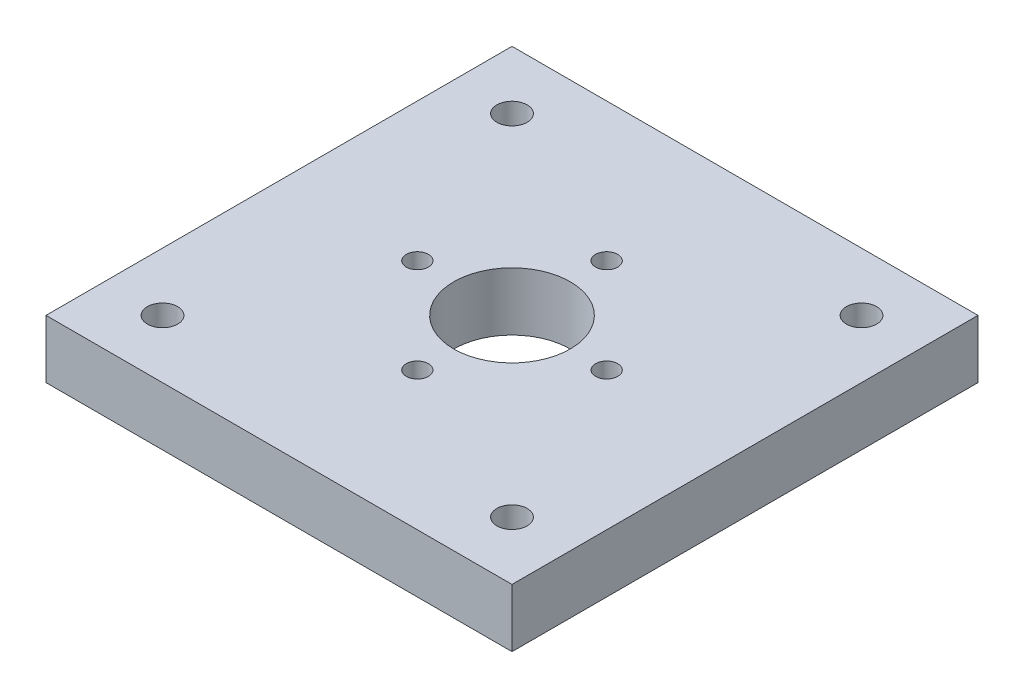
ISO-10303-21;
HEADER;
FILE_DESCRIPTION(('STEP AP214'),'2;1');
FILE_NAME('part.step','',(''),(''),'','','');
FILE_SCHEMA(('AUTOMOTIVE_DESIGN { 1 0 10303 214 1 1 1 1 }'));
ENDSEC;
DATA;
#1=APPLICATION_CONTEXT('core data for automotive mechanical design processes');
#2=APPLICATION_PROTOCOL_DEFINITION('international standard','automotive_design',2000,#1);
#3=PRODUCT_CONTEXT('',#1,'mechanical');
#4=PRODUCT('Part','Part','',(#3));
#5=PRODUCT_RELATED_PRODUCT_CATEGORY('part','',(#4));
#6=PRODUCT_DEFINITION_FORMATION('','',#4);
#7=PRODUCT_DEFINITION_CONTEXT('part definition',#1,'design');
#8=PRODUCT_DEFINITION('design','',#6,#7);
#9=PRODUCT_DEFINITION_SHAPE('','',#8);
#10=(LENGTH_UNIT() NAMED_UNIT(*) SI_UNIT(.MILLI.,.METRE.));
#11=(NAMED_UNIT(*) PLANE_ANGLE_UNIT() SI_UNIT($,.RADIAN.));
#12=(NAMED_UNIT(*) SI_UNIT($,.STERADIAN.) SOLID_ANGLE_UNIT());
#13=UNCERTAINTY_MEASURE_WITH_UNIT(LENGTH_MEASURE(1.E-05),#10,'distance_accuracy_value','');
#14=(GEOMETRIC_REPRESENTATION_CONTEXT(3) GLOBAL_UNCERTAINTY_ASSIGNED_CONTEXT((#13)) GLOBAL_UNIT_ASSIGNED_CONTEXT((#10,
#11,#12)) REPRESENTATION_CONTEXT('',''));
#15=CARTESIAN_POINT('',(0.,0.,0.));
#16=DIRECTION('',(0.,0.,1.));
#17=DIRECTION('',(1.,0.,0.));
#18=AXIS2_PLACEMENT_3D('',#15,#16,#17);
#19=CARTESIAN_POINT('',(0.,0.5,0.));
#20=DIRECTION('',(0.,1.,0.));
#21=DIRECTION('',(0.,0.,1.));
#22=AXIS2_PLACEMENT_3D('',#19,#20,#21);
#23=PLANE('',#22);
#24=CARTESIAN_POINT('',(1.5,0.5,1.5));
#25=DIRECTION('',(0.,1.,0.));
#26=DIRECTION('',(0.,0.,-1.));
#27=AXIS2_PLACEMENT_3D('',#24,#25,#26);
#28=CIRCLE('',#27,0.13);
#29=CARTESIAN_POINT('',(1.5,0.5,1.37));
#30=VERTEX_POINT('',#29);
#31=EDGE_CURVE('E154',#30,#30,#28,.T.);
#32=ORIENTED_EDGE('',*,*,#31,.F.);
#33=EDGE_LOOP('',(#32));
#34=FACE_BOUND('',#33,.T.);
#35=CARTESIAN_POINT('',(0.,0.5,0.8125));
#36=DIRECTION('',(0.,1.,0.));
#37=DIRECTION('',(0.,0.,1.));
#38=AXIS2_PLACEMENT_3D('',#35,#36,#37);
#39=CIRCLE('',#38,0.095);
#40=CARTESIAN_POINT('',(0.,0.5,0.9075));
#41=VERTEX_POINT('',#40);
#42=EDGE_CURVE('E142',#41,#41,#39,.T.);
#43=ORIENTED_EDGE('',*,*,#42,.F.);
#44=EDGE_LOOP('',(#43));
#45=FACE_BOUND('',#44,.T.);
#46=CARTESIAN_POINT('',(-1.5,0.5,-1.49999999999999));
#47=DIRECTION('',(0.,1.,0.));
#48=DIRECTION('',(0.,0.,-1.));
#49=AXIS2_PLACEMENT_3D('',#46,#47,#48);
#50=CIRCLE('',#49,0.13);
#51=CARTESIAN_POINT('',(-1.5,0.5,-1.62999999999999));
#52=VERTEX_POINT('',#51);
#53=EDGE_CURVE('E130',#52,#52,#50,.T.);
#54=ORIENTED_EDGE('',*,*,#53,.F.);
#55=EDGE_LOOP('',(#54));
#56=FACE_BOUND('',#55,.T.);
#57=CARTESIAN_POINT('',(1.5,0.5,-1.49999999999999));
#58=DIRECTION('',(0.,1.,0.));
#59=DIRECTION('',(0.,0.,1.));
#60=AXIS2_PLACEMENT_3D('',#57,#58,#59);
#61=CIRCLE('',#60,0.13);
#62=CARTESIAN_POINT('',(1.5,0.5,-1.36999999999999));
#63=VERTEX_POINT('',#62);
#64=EDGE_CURVE('E118',#63,#63,#61,.T.);
#65=ORIENTED_EDGE('',*,*,#64,.F.);
#66=EDGE_LOOP('',(#65));
#67=FACE_BOUND('',#66,.T.);
#68=DIRECTION('',(0.,0.,-1.));
#69=VECTOR('',#68,1.);
#70=CARTESIAN_POINT('',(2.,0.5,-1.99999999999999));
#71=LINE('',#70,#69);
#72=CARTESIAN_POINT('',(2.,0.5,2.00000000000001));
#73=VERTEX_POINT('',#72);
#74=CARTESIAN_POINT('',(2.,0.5,-1.99999999999999));
#75=VERTEX_POINT('',#74);
#76=EDGE_CURVE('E88',#73,#75,#71,.T.);
#77=ORIENTED_EDGE('',*,*,#76,.T.);
#78=DIRECTION('',(-1.,0.,0.));
#79=VECTOR('',#78,1.);
#80=CARTESIAN_POINT('',(-2.00000000000001,0.5,-1.99999999999999));
#81=LINE('',#80,#79);
#82=CARTESIAN_POINT('',(-2.00000000000001,0.5,-1.99999999999999));
#83=VERTEX_POINT('',#82);
#84=EDGE_CURVE('E83',#75,#83,#81,.T.);
#85=ORIENTED_EDGE('',*,*,#84,.T.);
#86=DIRECTION('',(0.,0.,1.));
#87=VECTOR('',#86,1.);
#88=CARTESIAN_POINT('',(-2.00000000000001,0.5,-1.99999999999999));
#89=LINE('',#88,#87);
#90=CARTESIAN_POINT('',(-2.,0.5,2.00000000000001));
#91=VERTEX_POINT('',#90);
#92=EDGE_CURVE('E86',#83,#91,#89,.T.);
#93=ORIENTED_EDGE('',*,*,#92,.T.);
#94=DIRECTION('',(1.,0.,0.));
#95=VECTOR('',#94,1.);
#96=CARTESIAN_POINT('',(-2.,0.5,2.00000000000001));
#97=LINE('',#96,#95);
#98=EDGE_CURVE('E53',#91,#73,#97,.T.);
#99=ORIENTED_EDGE('',*,*,#98,.T.);
#100=EDGE_LOOP('',(#77,#85,#93,#99));
#101=FACE_BOUND('',#100,.T.);
#102=CARTESIAN_POINT('',(0.,0.5,0.));
#103=DIRECTION('',(0.,1.,0.));
#104=DIRECTION('',(0.,0.,1.));
#105=AXIS2_PLACEMENT_3D('',#102,#103,#104);
#106=CIRCLE('',#105,0.5);
#107=CARTESIAN_POINT('',(0.,0.5,0.500000000000007));
#108=VERTEX_POINT('',#107);
#109=EDGE_CURVE('E103',#108,#108,#106,.T.);
#110=ORIENTED_EDGE('',*,*,#109,.F.);
#111=EDGE_LOOP('',(#110));
#112=FACE_BOUND('',#111,.T.);
#113=CARTESIAN_POINT('',(0.,0.5,-0.812499999999993));
#114=DIRECTION('',(0.,1.,0.));
#115=DIRECTION('',(0.,0.,1.));
#116=AXIS2_PLACEMENT_3D('',#113,#114,#115);
#117=CIRCLE('',#116,0.095);
#118=CARTESIAN_POINT('',(0.,0.5,-0.717499999999993));
#119=VERTEX_POINT('',#118);
#120=EDGE_CURVE('E124',#119,#119,#117,.T.);
#121=ORIENTED_EDGE('',*,*,#120,.F.);
#122=EDGE_LOOP('',(#121));
#123=FACE_BOUND('',#122,.T.);
#124=CARTESIAN_POINT('',(0.812499999999993,0.5,0.));
#125=DIRECTION('',(0.,1.,0.));
#126=DIRECTION('',(0.,0.,1.));
#127=AXIS2_PLACEMENT_3D('',#124,#125,#126);
#128=CIRCLE('',#127,0.095);
#129=CARTESIAN_POINT('',(0.812499999999993,0.5,0.0950000000000011));
#130=VERTEX_POINT('',#129);
#131=EDGE_CURVE('E136',#130,#130,#128,.T.);
#132=ORIENTED_EDGE('',*,*,#131,.F.);
#133=EDGE_LOOP('',(#132));
#134=FACE_BOUND('',#133,.T.);
#135=CARTESIAN_POINT('',(-0.812499999999993,0.5,0.));
#136=DIRECTION('',(0.,1.,0.));
#137=DIRECTION('',(0.,0.,1.));
#138=AXIS2_PLACEMENT_3D('',#135,#136,#137);
#139=CIRCLE('',#138,0.095);
#140=CARTESIAN_POINT('',(-0.812499999999993,0.5,0.0949999999999933));
#141=VERTEX_POINT('',#140);
#142=EDGE_CURVE('E148',#141,#141,#139,.T.);
#143=ORIENTED_EDGE('',*,*,#142,.F.);
#144=EDGE_LOOP('',(#143));
#145=FACE_BOUND('',#144,.T.);
#146=CARTESIAN_POINT('',(-1.5,0.5,1.5));
#147=DIRECTION('',(0.,1.,0.));
#148=DIRECTION('',(0.,0.,1.));
#149=AXIS2_PLACEMENT_3D('',#146,#147,#148);
#150=CIRCLE('',#149,0.13);
#151=CARTESIAN_POINT('',(-1.5,0.5,1.63));
#152=VERTEX_POINT('',#151);
#153=EDGE_CURVE('E160',#152,#152,#150,.T.);
#154=ORIENTED_EDGE('',*,*,#153,.F.);
#155=EDGE_LOOP('',(#154));
#156=FACE_BOUND('',#155,.T.);
#157=ADVANCED_FACE('F36',(#34,#45,#56,#67,#101,#112,#123,#134,#145,#156),#23,.T.);
#158=CARTESIAN_POINT('',(0.,0.,0.));
#159=DIRECTION('',(0.,1.,0.));
#160=DIRECTION('',(0.,0.,1.));
#161=AXIS2_PLACEMENT_3D('',#158,#159,#160);
#162=PLANE('',#161);
#163=DIRECTION('',(0.,0.,-1.));
#164=VECTOR('',#163,1.);
#165=CARTESIAN_POINT('',(2.,0.,-1.99999999999999));
#166=LINE('',#165,#164);
#167=CARTESIAN_POINT('',(2.,0.,2.00000000000001));
#168=VERTEX_POINT('',#167);
#169=CARTESIAN_POINT('',(2.,0.,-1.99999999999999));
#170=VERTEX_POINT('',#169);
#171=EDGE_CURVE('E100',#168,#170,#166,.T.);
#172=ORIENTED_EDGE('',*,*,#171,.F.);
#173=DIRECTION('',(1.,0.,0.));
#174=VECTOR('',#173,1.);
#175=CARTESIAN_POINT('',(-2.,0.,2.00000000000001));
#176=LINE('',#175,#174);
#177=CARTESIAN_POINT('',(-2.,0.,2.00000000000001));
#178=VERTEX_POINT('',#177);
#179=EDGE_CURVE('E76',#178,#168,#176,.T.);
#180=ORIENTED_EDGE('',*,*,#179,.F.);
#181=DIRECTION('',(0.,0.,1.));
#182=VECTOR('',#181,1.);
#183=CARTESIAN_POINT('',(-2.00000000000001,0.,-1.99999999999999));
#184=LINE('',#183,#182);
#185=CARTESIAN_POINT('',(-2.00000000000001,0.,-1.99999999999999));
#186=VERTEX_POINT('',#185);
#187=EDGE_CURVE('E70',#186,#178,#184,.T.);
#188=ORIENTED_EDGE('',*,*,#187,.F.);
#189=DIRECTION('',(-1.,0.,0.));
#190=VECTOR('',#189,1.);
#191=CARTESIAN_POINT('',(-2.00000000000001,0.,-1.99999999999999));
#192=LINE('',#191,#190);
#193=EDGE_CURVE('E92',#170,#186,#192,.T.);
#194=ORIENTED_EDGE('',*,*,#193,.F.);
#195=EDGE_LOOP('',(#172,#180,#188,#194));
#196=FACE_BOUND('',#195,.T.);
#197=CARTESIAN_POINT('',(0.,0.,0.));
#198=DIRECTION('',(0.,1.,0.));
#199=DIRECTION('',(0.,0.,1.));
#200=AXIS2_PLACEMENT_3D('',#197,#198,#199);
#201=CIRCLE('',#200,0.5);
#202=CARTESIAN_POINT('',(0.,0.,0.500000000000007));
#203=VERTEX_POINT('',#202);
#204=EDGE_CURVE('E115',#203,#203,#201,.T.);
#205=ORIENTED_EDGE('',*,*,#204,.T.);
#206=EDGE_LOOP('',(#205));
#207=FACE_BOUND('',#206,.T.);
#208=CARTESIAN_POINT('',(1.5,0.,-1.49999999999999));
#209=DIRECTION('',(0.,1.,0.));
#210=DIRECTION('',(0.,0.,1.));
#211=AXIS2_PLACEMENT_3D('',#208,#209,#210);
#212=CIRCLE('',#211,0.13);
#213=CARTESIAN_POINT('',(1.5,0.,-1.36999999999999));
#214=VERTEX_POINT('',#213);
#215=EDGE_CURVE('E121',#214,#214,#212,.T.);
#216=ORIENTED_EDGE('',*,*,#215,.T.);
#217=EDGE_LOOP('',(#216));
#218=FACE_BOUND('',#217,.T.);
#219=CARTESIAN_POINT('',(0.,0.,-0.812499999999993));
#220=DIRECTION('',(0.,1.,0.));
#221=DIRECTION('',(0.,0.,1.));
#222=AXIS2_PLACEMENT_3D('',#219,#220,#221);
#223=CIRCLE('',#222,0.095);
#224=CARTESIAN_POINT('',(0.,0.,-0.717499999999993));
#225=VERTEX_POINT('',#224);
#226=EDGE_CURVE('E127',#225,#225,#223,.T.);
#227=ORIENTED_EDGE('',*,*,#226,.T.);
#228=EDGE_LOOP('',(#227));
#229=FACE_BOUND('',#228,.T.);
#230=CARTESIAN_POINT('',(-1.5,0.,-1.49999999999999));
#231=DIRECTION('',(0.,1.,0.));
#232=DIRECTION('',(0.,0.,-1.));
#233=AXIS2_PLACEMENT_3D('',#230,#231,#232);
#234=CIRCLE('',#233,0.13);
#235=CARTESIAN_POINT('',(-1.5,0.,-1.62999999999999));
#236=VERTEX_POINT('',#235);
#237=EDGE_CURVE('E133',#236,#236,#234,.T.);
#238=ORIENTED_EDGE('',*,*,#237,.T.);
#239=EDGE_LOOP('',(#238));
#240=FACE_BOUND('',#239,.T.);
#241=CARTESIAN_POINT('',(0.812499999999993,0.,0.));
#242=DIRECTION('',(0.,1.,0.));
#243=DIRECTION('',(0.,0.,1.));
#244=AXIS2_PLACEMENT_3D('',#241,#242,#243);
#245=CIRCLE('',#244,0.095);
#246=CARTESIAN_POINT('',(0.812499999999993,0.,0.0950000000000011));
#247=VERTEX_POINT('',#246);
#248=EDGE_CURVE('E139',#247,#247,#245,.T.);
#249=ORIENTED_EDGE('',*,*,#248,.T.);
#250=EDGE_LOOP('',(#249));
#251=FACE_BOUND('',#250,.T.);
#252=CARTESIAN_POINT('',(0.,0.,0.8125));
#253=DIRECTION('',(0.,1.,0.));
#254=DIRECTION('',(0.,0.,1.));
#255=AXIS2_PLACEMENT_3D('',#252,#253,#254);
#256=CIRCLE('',#255,0.095);
#257=CARTESIAN_POINT('',(0.,0.,0.9075));
#258=VERTEX_POINT('',#257);
#259=EDGE_CURVE('E145',#258,#258,#256,.T.);
#260=ORIENTED_EDGE('',*,*,#259,.T.);
#261=EDGE_LOOP('',(#260));
#262=FACE_BOUND('',#261,.T.);
#263=CARTESIAN_POINT('',(-0.812499999999993,0.,0.));
#264=DIRECTION('',(0.,1.,0.));
#265=DIRECTION('',(0.,0.,1.));
#266=AXIS2_PLACEMENT_3D('',#263,#264,#265);
#267=CIRCLE('',#266,0.095);
#268=CARTESIAN_POINT('',(-0.812499999999993,0.,0.0949999999999933));
#269=VERTEX_POINT('',#268);
#270=EDGE_CURVE('E151',#269,#269,#267,.T.);
#271=ORIENTED_EDGE('',*,*,#270,.T.);
#272=EDGE_LOOP('',(#271));
#273=FACE_BOUND('',#272,.T.);
#274=CARTESIAN_POINT('',(1.5,0.,1.5));
#275=DIRECTION('',(0.,1.,0.));
#276=DIRECTION('',(0.,0.,-1.));
#277=AXIS2_PLACEMENT_3D('',#274,#275,#276);
#278=CIRCLE('',#277,0.13);
#279=CARTESIAN_POINT('',(1.5,0.,1.37));
#280=VERTEX_POINT('',#279);
#281=EDGE_CURVE('E157',#280,#280,#278,.T.);
#282=ORIENTED_EDGE('',*,*,#281,.T.);
#283=EDGE_LOOP('',(#282));
#284=FACE_BOUND('',#283,.T.);
#285=CARTESIAN_POINT('',(-1.5,0.,1.5));
#286=DIRECTION('',(0.,1.,0.));
#287=DIRECTION('',(0.,0.,1.));
#288=AXIS2_PLACEMENT_3D('',#285,#286,#287);
#289=CIRCLE('',#288,0.13);
#290=CARTESIAN_POINT('',(-1.5,0.,1.63));
#291=VERTEX_POINT('',#290);
#292=EDGE_CURVE('E163',#291,#291,#289,.T.);
#293=ORIENTED_EDGE('',*,*,#292,.T.);
#294=EDGE_LOOP('',(#293));
#295=FACE_BOUND('',#294,.T.);
#296=ADVANCED_FACE('F111',(#196,#207,#218,#229,#240,#251,#262,#273,#284,#295),#162,.F.);
#297=CARTESIAN_POINT('',(2.,0.5,-1.99999999999999));
#298=DIRECTION('',(-1.,0.,0.));
#299=DIRECTION('',(0.,0.,1.));
#300=AXIS2_PLACEMENT_3D('',#297,#298,#299);
#301=PLANE('',#300);
#302=ORIENTED_EDGE('',*,*,#171,.T.);
#303=DIRECTION('',(0.,-1.,0.));
#304=VECTOR('',#303,1.);
#305=CARTESIAN_POINT('',(2.,0.5,-1.99999999999999));
#306=LINE('',#305,#304);
#307=EDGE_CURVE('E11',#75,#170,#306,.T.);
#308=ORIENTED_EDGE('',*,*,#307,.F.);
#309=ORIENTED_EDGE('',*,*,#76,.F.);
#310=DIRECTION('',(0.,-1.,0.));
#311=VECTOR('',#310,1.);
#312=CARTESIAN_POINT('',(2.,0.5,2.00000000000001));
#313=LINE('',#312,#311);
#314=EDGE_CURVE('E96',#73,#168,#313,.T.);
#315=ORIENTED_EDGE('',*,*,#314,.T.);
#316=EDGE_LOOP('',(#302,#308,#309,#315));
#317=FACE_BOUND('',#316,.T.);
#318=ADVANCED_FACE('F38',(#317),#301,.F.);
#319=CARTESIAN_POINT('',(-2.00000000000001,0.5,-1.99999999999999));
#320=DIRECTION('',(0.,0.,1.));
#321=DIRECTION('',(1.,0.,0.));
#322=AXIS2_PLACEMENT_3D('',#319,#320,#321);
#323=PLANE('',#322);
#324=ORIENTED_EDGE('',*,*,#193,.T.);
#325=DIRECTION('',(0.,-1.,0.));
#326=VECTOR('',#325,1.);
#327=CARTESIAN_POINT('',(-2.00000000000001,0.5,-1.99999999999999));
#328=LINE('',#327,#326);
#329=EDGE_CURVE('E45',#83,#186,#328,.T.);
#330=ORIENTED_EDGE('',*,*,#329,.F.);
#331=ORIENTED_EDGE('',*,*,#84,.F.);
#332=ORIENTED_EDGE('',*,*,#307,.T.);
#333=EDGE_LOOP('',(#324,#330,#331,#332));
#334=FACE_BOUND('',#333,.T.);
#335=ADVANCED_FACE('F91',(#334),#323,.F.);
#336=CARTESIAN_POINT('',(-2.00000000000001,0.5,-1.99999999999999));
#337=DIRECTION('',(1.,0.,0.));
#338=DIRECTION('',(0.,0.,-1.));
#339=AXIS2_PLACEMENT_3D('',#336,#337,#338);
#340=PLANE('',#339);
#341=ORIENTED_EDGE('',*,*,#187,.T.);
#342=DIRECTION('',(0.,-1.,0.));
#343=VECTOR('',#342,1.);
#344=CARTESIAN_POINT('',(-2.,0.5,2.00000000000001));
#345=LINE('',#344,#343);
#346=EDGE_CURVE('E93',#91,#178,#345,.T.);
#347=ORIENTED_EDGE('',*,*,#346,.F.);
#348=ORIENTED_EDGE('',*,*,#92,.F.);
#349=ORIENTED_EDGE('',*,*,#329,.T.);
#350=EDGE_LOOP('',(#341,#347,#348,#349));
#351=FACE_BOUND('',#350,.T.);
#352=ADVANCED_FACE('F94',(#351),#340,.F.);
#353=CARTESIAN_POINT('',(-2.,0.5,2.00000000000001));
#354=DIRECTION('',(0.,0.,-1.));
#355=DIRECTION('',(-1.,0.,0.));
#356=AXIS2_PLACEMENT_3D('',#353,#354,#355);
#357=PLANE('',#356);
#358=ORIENTED_EDGE('',*,*,#179,.T.);
#359=ORIENTED_EDGE('',*,*,#314,.F.);
#360=ORIENTED_EDGE('',*,*,#98,.F.);
#361=ORIENTED_EDGE('',*,*,#346,.T.);
#362=EDGE_LOOP('',(#358,#359,#360,#361));
#363=FACE_BOUND('',#362,.T.);
#364=ADVANCED_FACE('F108',(#363),#357,.F.);
#365=CARTESIAN_POINT('',(0.,0.5,0.));
#366=DIRECTION('',(0.,-1.,0.));
#367=DIRECTION('',(0.,0.,-1.));
#368=AXIS2_PLACEMENT_3D('',#365,#366,#367);
#369=CYLINDRICAL_SURFACE('',#368,0.5);
#370=ORIENTED_EDGE('',*,*,#109,.T.);
#371=EDGE_LOOP('',(#370));
#372=FACE_BOUND('',#371,.T.);
#373=ORIENTED_EDGE('',*,*,#204,.F.);
#374=EDGE_LOOP('',(#373));
#375=FACE_BOUND('',#374,.T.);
#376=ADVANCED_FACE('F182',(#372,#375),#369,.F.);
#377=CARTESIAN_POINT('',(1.5,0.5,-1.49999999999999));
#378=DIRECTION('',(0.,-1.,0.));
#379=DIRECTION('',(0.,0.,-1.));
#380=AXIS2_PLACEMENT_3D('',#377,#378,#379);
#381=CYLINDRICAL_SURFACE('',#380,0.13);
#382=ORIENTED_EDGE('',*,*,#64,.T.);
#383=EDGE_LOOP('',(#382));
#384=FACE_BOUND('',#383,.T.);
#385=ORIENTED_EDGE('',*,*,#215,.F.);
#386=EDGE_LOOP('',(#385));
#387=FACE_BOUND('',#386,.T.);
#388=ADVANCED_FACE('F236',(#384,#387),#381,.F.);
#389=CARTESIAN_POINT('',(0.,0.5,-0.812499999999993));
#390=DIRECTION('',(0.,-1.,0.));
#391=DIRECTION('',(0.,0.,-1.));
#392=AXIS2_PLACEMENT_3D('',#389,#390,#391);
#393=CYLINDRICAL_SURFACE('',#392,0.095);
#394=ORIENTED_EDGE('',*,*,#120,.T.);
#395=EDGE_LOOP('',(#394));
#396=FACE_BOUND('',#395,.T.);
#397=ORIENTED_EDGE('',*,*,#226,.F.);
#398=EDGE_LOOP('',(#397));
#399=FACE_BOUND('',#398,.T.);
#400=ADVANCED_FACE('F245',(#396,#399),#393,.F.);
#401=CARTESIAN_POINT('',(-1.5,0.5,-1.49999999999999));
#402=DIRECTION('',(0.,-1.,0.));
#403=DIRECTION('',(0.,0.,-1.));
#404=AXIS2_PLACEMENT_3D('',#401,#402,#403);
#405=CYLINDRICAL_SURFACE('',#404,0.13);
#406=ORIENTED_EDGE('',*,*,#53,.T.);
#407=EDGE_LOOP('',(#406));
#408=FACE_BOUND('',#407,.T.);
#409=ORIENTED_EDGE('',*,*,#237,.F.);
#410=EDGE_LOOP('',(#409));
#411=FACE_BOUND('',#410,.T.);
#412=ADVANCED_FACE('F254',(#408,#411),#405,.F.);
#413=CARTESIAN_POINT('',(0.812499999999993,0.5,0.));
#414=DIRECTION('',(0.,-1.,0.));
#415=DIRECTION('',(0.,0.,-1.));
#416=AXIS2_PLACEMENT_3D('',#413,#414,#415);
#417=CYLINDRICAL_SURFACE('',#416,0.095);
#418=ORIENTED_EDGE('',*,*,#131,.T.);
#419=EDGE_LOOP('',(#418));
#420=FACE_BOUND('',#419,.T.);
#421=ORIENTED_EDGE('',*,*,#248,.F.);
#422=EDGE_LOOP('',(#421));
#423=FACE_BOUND('',#422,.T.);
#424=ADVANCED_FACE('F264',(#420,#423),#417,.F.);
#425=CARTESIAN_POINT('',(0.,0.5,0.8125));
#426=DIRECTION('',(0.,-1.,0.));
#427=DIRECTION('',(0.,0.,-1.));
#428=AXIS2_PLACEMENT_3D('',#425,#426,#427);
#429=CYLINDRICAL_SURFACE('',#428,0.095);
#430=ORIENTED_EDGE('',*,*,#42,.T.);
#431=EDGE_LOOP('',(#430));
#432=FACE_BOUND('',#431,.T.);
#433=ORIENTED_EDGE('',*,*,#259,.F.);
#434=EDGE_LOOP('',(#433));
#435=FACE_BOUND('',#434,.T.);
#436=ADVANCED_FACE('F274',(#432,#435),#429,.F.);
#437=CARTESIAN_POINT('',(-0.812499999999993,0.5,0.));
#438=DIRECTION('',(0.,-1.,0.));
#439=DIRECTION('',(0.,0.,-1.));
#440=AXIS2_PLACEMENT_3D('',#437,#438,#439);
#441=CYLINDRICAL_SURFACE('',#440,0.095);
#442=ORIENTED_EDGE('',*,*,#142,.T.);
#443=EDGE_LOOP('',(#442));
#444=FACE_BOUND('',#443,.T.);
#445=ORIENTED_EDGE('',*,*,#270,.F.);
#446=EDGE_LOOP('',(#445));
#447=FACE_BOUND('',#446,.T.);
#448=ADVANCED_FACE('F284',(#444,#447),#441,.F.);
#449=CARTESIAN_POINT('',(1.5,0.5,1.5));
#450=DIRECTION('',(0.,-1.,0.));
#451=DIRECTION('',(0.,0.,-1.));
#452=AXIS2_PLACEMENT_3D('',#449,#450,#451);
#453=CYLINDRICAL_SURFACE('',#452,0.13);
#454=ORIENTED_EDGE('',*,*,#31,.T.);
#455=EDGE_LOOP('',(#454));
#456=FACE_BOUND('',#455,.T.);
#457=ORIENTED_EDGE('',*,*,#281,.F.);
#458=EDGE_LOOP('',(#457));
#459=FACE_BOUND('',#458,.T.);
#460=ADVANCED_FACE('F294',(#456,#459),#453,.F.);
#461=CARTESIAN_POINT('',(-1.5,0.5,1.5));
#462=DIRECTION('',(0.,-1.,0.));
#463=DIRECTION('',(0.,0.,-1.));
#464=AXIS2_PLACEMENT_3D('',#461,#462,#463);
#465=CYLINDRICAL_SURFACE('',#464,0.13);
#466=ORIENTED_EDGE('',*,*,#153,.T.);
#467=EDGE_LOOP('',(#466));
#468=FACE_BOUND('',#467,.T.);
#469=ORIENTED_EDGE('',*,*,#292,.F.);
#470=EDGE_LOOP('',(#469));
#471=FACE_BOUND('',#470,.T.);
#472=ADVANCED_FACE('F169',(#468,#471),#465,.F.);
#473=CLOSED_SHELL('',(#157,#296,#318,#335,#352,#364,#376,#388,#400,#412,#424,#436,#448,#460,#472));
#474=MANIFOLD_SOLID_BREP('B2',#473);
#475=ADVANCED_BREP_SHAPE_REPRESENTATION('',(#18,#474),#14);
#476=SHAPE_DEFINITION_REPRESENTATION(#9,#475);
ENDSEC;
END-ISO-10303-21;
